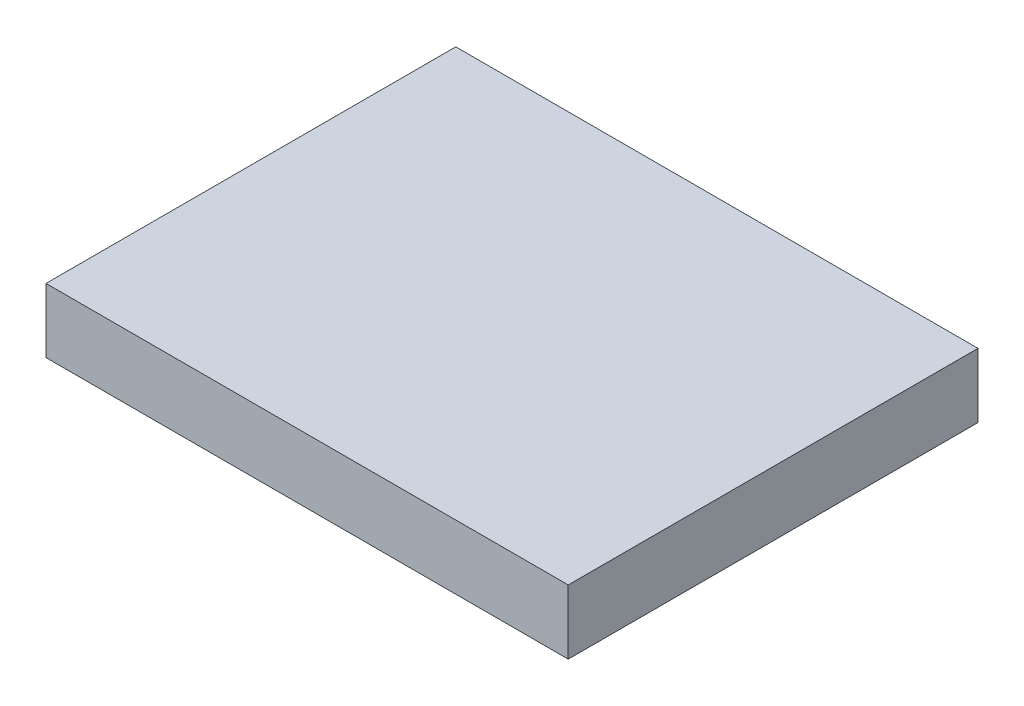
ISO-10303-21;
HEADER;
FILE_DESCRIPTION(('STEP AP214'),'2;1');
FILE_NAME('part.step','',(''),(''),'','','');
FILE_SCHEMA(('AUTOMOTIVE_DESIGN { 1 0 10303 214 1 1 1 1 }'));
ENDSEC;
DATA;
#1=APPLICATION_CONTEXT('core data for automotive mechanical design processes');
#2=APPLICATION_PROTOCOL_DEFINITION('international standard','automotive_design',2000,#1);
#3=PRODUCT_CONTEXT('',#1,'mechanical');
#4=PRODUCT('Part','Part','',(#3));
#5=PRODUCT_RELATED_PRODUCT_CATEGORY('part','',(#4));
#6=PRODUCT_DEFINITION_FORMATION('','',#4);
#7=PRODUCT_DEFINITION_CONTEXT('part definition',#1,'design');
#8=PRODUCT_DEFINITION('design','',#6,#7);
#9=PRODUCT_DEFINITION_SHAPE('','',#8);
#10=(LENGTH_UNIT() NAMED_UNIT(*) SI_UNIT(.MILLI.,.METRE.));
#11=(NAMED_UNIT(*) PLANE_ANGLE_UNIT() SI_UNIT($,.RADIAN.));
#12=(NAMED_UNIT(*) SI_UNIT($,.STERADIAN.) SOLID_ANGLE_UNIT());
#13=UNCERTAINTY_MEASURE_WITH_UNIT(LENGTH_MEASURE(1.E-05),#10,'distance_accuracy_value','');
#14=(GEOMETRIC_REPRESENTATION_CONTEXT(3) GLOBAL_UNCERTAINTY_ASSIGNED_CONTEXT((#13)) GLOBAL_UNIT_ASSIGNED_CONTEXT((#10,
#11,#12)) REPRESENTATION_CONTEXT('',''));
#15=CARTESIAN_POINT('',(0.,0.,0.));
#16=DIRECTION('',(0.,0.,1.));
#17=DIRECTION('',(1.,0.,0.));
#18=AXIS2_PLACEMENT_3D('',#15,#16,#17);
#19=CARTESIAN_POINT('',(64.9999999999999,8.,1.9422898234477E-13));
#20=DIRECTION('',(0.,0.,-1.));
#21=DIRECTION('',(-1.,0.,0.));
#22=AXIS2_PLACEMENT_3D('',#19,#20,#21);
#23=PLANE('',#22);
#24=DIRECTION('',(1.,0.,0.));
#25=VECTOR('',#24,1.);
#26=CARTESIAN_POINT('',(64.9999999999999,0.,1.9422898234477E-13));
#27=LINE('',#26,#25);
#28=CARTESIAN_POINT('',(0.,0.,0.));
#29=VERTEX_POINT('',#28);
#30=CARTESIAN_POINT('',(64.9999999999999,0.,1.9422898234477E-13));
#31=VERTEX_POINT('',#30);
#32=EDGE_CURVE('E107',#29,#31,#27,.T.);
#33=ORIENTED_EDGE('',*,*,#32,.T.);
#34=DIRECTION('',(0.,-1.,0.));
#35=VECTOR('',#34,1.);
#36=CARTESIAN_POINT('',(64.9999999999999,8.,1.9422898234477E-13));
#37=LINE('',#36,#35);
#38=CARTESIAN_POINT('',(64.9999999999999,8.,1.9422898234477E-13));
#39=VERTEX_POINT('',#38);
#40=EDGE_CURVE('E11',#39,#31,#37,.T.);
#41=ORIENTED_EDGE('',*,*,#40,.F.);
#42=DIRECTION('',(1.,0.,0.));
#43=VECTOR('',#42,1.);
#44=CARTESIAN_POINT('',(64.9999999999999,8.,1.9422898234477E-13));
#45=LINE('',#44,#43);
#46=CARTESIAN_POINT('',(0.,8.,0.));
#47=VERTEX_POINT('',#46);
#48=EDGE_CURVE('E91',#47,#39,#45,.T.);
#49=ORIENTED_EDGE('',*,*,#48,.F.);
#50=DIRECTION('',(0.,-1.,0.));
#51=VECTOR('',#50,1.);
#52=CARTESIAN_POINT('',(0.,8.,0.));
#53=LINE('',#52,#51);
#54=EDGE_CURVE('E103',#47,#29,#53,.T.);
#55=ORIENTED_EDGE('',*,*,#54,.T.);
#56=EDGE_LOOP('',(#33,#41,#49,#55));
#57=FACE_BOUND('',#56,.T.);
#58=ADVANCED_FACE('F39',(#57),#23,.F.);
#59=CARTESIAN_POINT('',(65.,8.,-50.9999999999999));
#60=DIRECTION('',(-1.,0.,0.));
#61=DIRECTION('',(0.,0.,1.));
#62=AXIS2_PLACEMENT_3D('',#59,#60,#61);
#63=PLANE('',#62);
#64=DIRECTION('',(0.,0.,-1.));
#65=VECTOR('',#64,1.);
#66=CARTESIAN_POINT('',(65.,0.,-50.9999999999999));
#67=LINE('',#66,#65);
#68=CARTESIAN_POINT('',(65.,0.,-50.9999999999999));
#69=VERTEX_POINT('',#68);
#70=EDGE_CURVE('E96',#31,#69,#67,.T.);
#71=ORIENTED_EDGE('',*,*,#70,.T.);
#72=DIRECTION('',(0.,-1.,0.));
#73=VECTOR('',#72,1.);
#74=CARTESIAN_POINT('',(65.,8.,-50.9999999999999));
#75=LINE('',#74,#73);
#76=CARTESIAN_POINT('',(65.,8.,-50.9999999999999));
#77=VERTEX_POINT('',#76);
#78=EDGE_CURVE('E48',#77,#69,#75,.T.);
#79=ORIENTED_EDGE('',*,*,#78,.F.);
#80=DIRECTION('',(0.,0.,-1.));
#81=VECTOR('',#80,1.);
#82=CARTESIAN_POINT('',(65.,8.,-50.9999999999999));
#83=LINE('',#82,#81);
#84=EDGE_CURVE('E86',#39,#77,#83,.T.);
#85=ORIENTED_EDGE('',*,*,#84,.F.);
#86=ORIENTED_EDGE('',*,*,#40,.T.);
#87=EDGE_LOOP('',(#71,#79,#85,#86));
#88=FACE_BOUND('',#87,.T.);
#89=ADVANCED_FACE('F95',(#88),#63,.F.);
#90=CARTESIAN_POINT('',(0.,8.,-50.9999999999999));
#91=DIRECTION('',(0.,0.,1.));
#92=DIRECTION('',(1.,0.,0.));
#93=AXIS2_PLACEMENT_3D('',#90,#91,#92);
#94=PLANE('',#93);
#95=DIRECTION('',(-1.,0.,0.));
#96=VECTOR('',#95,1.);
#97=CARTESIAN_POINT('',(0.,0.,-50.9999999999999));
#98=LINE('',#97,#96);
#99=CARTESIAN_POINT('',(0.,0.,-50.9999999999999));
#100=VERTEX_POINT('',#99);
#101=EDGE_CURVE('E73',#69,#100,#98,.T.);
#102=ORIENTED_EDGE('',*,*,#101,.T.);
#103=DIRECTION('',(0.,-1.,0.));
#104=VECTOR('',#103,1.);
#105=CARTESIAN_POINT('',(0.,8.,-50.9999999999999));
#106=LINE('',#105,#104);
#107=CARTESIAN_POINT('',(0.,8.,-50.9999999999999));
#108=VERTEX_POINT('',#107);
#109=EDGE_CURVE('E98',#108,#100,#106,.T.);
#110=ORIENTED_EDGE('',*,*,#109,.F.);
#111=DIRECTION('',(-1.,0.,0.));
#112=VECTOR('',#111,1.);
#113=CARTESIAN_POINT('',(0.,8.,-50.9999999999999));
#114=LINE('',#113,#112);
#115=EDGE_CURVE('E89',#77,#108,#114,.T.);
#116=ORIENTED_EDGE('',*,*,#115,.F.);
#117=ORIENTED_EDGE('',*,*,#78,.T.);
#118=EDGE_LOOP('',(#102,#110,#116,#117));
#119=FACE_BOUND('',#118,.T.);
#120=ADVANCED_FACE('F99',(#119),#94,.F.);
#121=CARTESIAN_POINT('',(0.,8.,0.));
#122=DIRECTION('',(1.,0.,0.));
#123=DIRECTION('',(0.,0.,-1.));
#124=AXIS2_PLACEMENT_3D('',#121,#122,#123);
#125=PLANE('',#124);
#126=DIRECTION('',(0.,0.,1.));
#127=VECTOR('',#126,1.);
#128=CARTESIAN_POINT('',(0.,0.,0.));
#129=LINE('',#128,#127);
#130=EDGE_CURVE('E79',#100,#29,#129,.T.);
#131=ORIENTED_EDGE('',*,*,#130,.T.);
#132=ORIENTED_EDGE('',*,*,#54,.F.);
#133=DIRECTION('',(0.,0.,1.));
#134=VECTOR('',#133,1.);
#135=CARTESIAN_POINT('',(0.,8.,0.));
#136=LINE('',#135,#134);
#137=EDGE_CURVE('E56',#108,#47,#136,.T.);
#138=ORIENTED_EDGE('',*,*,#137,.F.);
#139=ORIENTED_EDGE('',*,*,#109,.T.);
#140=EDGE_LOOP('',(#131,#132,#138,#139));
#141=FACE_BOUND('',#140,.T.);
#142=ADVANCED_FACE('F120',(#141),#125,.F.);
#143=CARTESIAN_POINT('',(0.,8.,0.));
#144=DIRECTION('',(0.,-1.,0.));
#145=DIRECTION('',(0.,0.,-1.));
#146=AXIS2_PLACEMENT_3D('',#143,#144,#145);
#147=PLANE('',#146);
#148=ORIENTED_EDGE('',*,*,#48,.T.);
#149=ORIENTED_EDGE('',*,*,#84,.T.);
#150=ORIENTED_EDGE('',*,*,#115,.T.);
#151=ORIENTED_EDGE('',*,*,#137,.T.);
#152=EDGE_LOOP('',(#148,#149,#150,#151));
#153=FACE_BOUND('',#152,.T.);
#154=ADVANCED_FACE('F87',(#153),#147,.F.);
#155=CARTESIAN_POINT('',(0.,0.,0.));
#156=DIRECTION('',(0.,-1.,0.));
#157=DIRECTION('',(0.,0.,-1.));
#158=AXIS2_PLACEMENT_3D('',#155,#156,#157);
#159=PLANE('',#158);
#160=ORIENTED_EDGE('',*,*,#32,.F.);
#161=ORIENTED_EDGE('',*,*,#130,.F.);
#162=ORIENTED_EDGE('',*,*,#101,.F.);
#163=ORIENTED_EDGE('',*,*,#70,.F.);
#164=EDGE_LOOP('',(#160,#161,#162,#163));
#165=FACE_BOUND('',#164,.T.);
#166=ADVANCED_FACE('F123',(#165),#159,.T.);
#167=CLOSED_SHELL('',(#58,#89,#120,#142,#154,#166));
#168=MANIFOLD_SOLID_BREP('B2',#167);
#169=ADVANCED_BREP_SHAPE_REPRESENTATION('',(#18,#168),#14);
#170=SHAPE_DEFINITION_REPRESENTATION(#9,#169);
ENDSEC;
END-ISO-10303-21;
